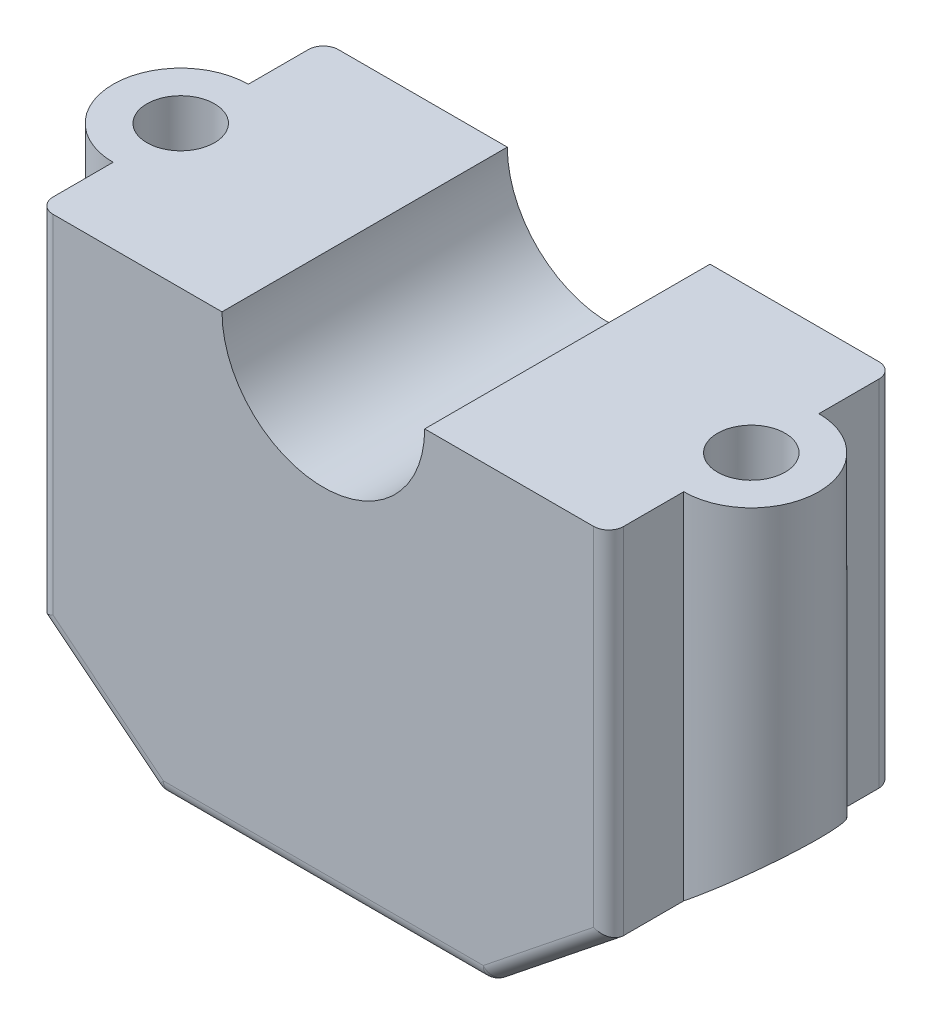
ISO-10303-21;
HEADER;
FILE_DESCRIPTION(('STEP AP214'),'2;1');
FILE_NAME('part.step','',(''),(''),'','','');
FILE_SCHEMA(('AUTOMOTIVE_DESIGN { 1 0 10303 214 1 1 1 1 }'));
ENDSEC;
DATA;
#1=APPLICATION_CONTEXT('core data for automotive mechanical design processes');
#2=APPLICATION_PROTOCOL_DEFINITION('international standard','automotive_design',2000,#1);
#3=PRODUCT_CONTEXT('',#1,'mechanical');
#4=PRODUCT('Part','Part','',(#3));
#5=PRODUCT_RELATED_PRODUCT_CATEGORY('part','',(#4));
#6=PRODUCT_DEFINITION_FORMATION('','',#4);
#7=PRODUCT_DEFINITION_CONTEXT('part definition',#1,'design');
#8=PRODUCT_DEFINITION('design','',#6,#7);
#9=PRODUCT_DEFINITION_SHAPE('','',#8);
#10=(LENGTH_UNIT() NAMED_UNIT(*) SI_UNIT(.MILLI.,.METRE.));
#11=(NAMED_UNIT(*) PLANE_ANGLE_UNIT() SI_UNIT($,.RADIAN.));
#12=(NAMED_UNIT(*) SI_UNIT($,.STERADIAN.) SOLID_ANGLE_UNIT());
#13=UNCERTAINTY_MEASURE_WITH_UNIT(LENGTH_MEASURE(1.E-05),#10,'distance_accuracy_value','');
#14=(GEOMETRIC_REPRESENTATION_CONTEXT(3) GLOBAL_UNCERTAINTY_ASSIGNED_CONTEXT((#13)) GLOBAL_UNIT_ASSIGNED_CONTEXT((#10,
#11,#12)) REPRESENTATION_CONTEXT('',''));
#15=CARTESIAN_POINT('',(0.,0.,0.));
#16=DIRECTION('',(0.,0.,1.));
#17=DIRECTION('',(1.,0.,0.));
#18=AXIS2_PLACEMENT_3D('',#15,#16,#17);
#19=CARTESIAN_POINT('',(0.,0.,0.));
#20=DIRECTION('',(0.,1.,0.));
#21=DIRECTION('',(0.,0.,1.));
#22=AXIS2_PLACEMENT_3D('',#19,#20,#21);
#23=PLANE('',#22);
#24=DIRECTION('',(0.,0.,-1.));
#25=VECTOR('',#24,1.);
#26=CARTESIAN_POINT('',(-21.2984378812836,0.,0.));
#27=LINE('',#26,#25);
#28=CARTESIAN_POINT('',(-21.2984378812836,0.,17.));
#29=VERTEX_POINT('',#28);
#30=CARTESIAN_POINT('',(-21.2984378812836,0.,-17.));
#31=VERTEX_POINT('',#30);
#32=EDGE_CURVE('E252',#29,#31,#27,.T.);
#33=ORIENTED_EDGE('',*,*,#32,.T.);
#34=DIRECTION('',(1.,0.,0.));
#35=VECTOR('',#34,1.);
#36=CARTESIAN_POINT('',(22.,0.,-17.));
#37=LINE('',#36,#35);
#38=CARTESIAN_POINT('',(21.2984378812836,0.,-17.));
#39=VERTEX_POINT('',#38);
#40=EDGE_CURVE('E259',#31,#39,#37,.T.);
#41=ORIENTED_EDGE('',*,*,#40,.T.);
#42=DIRECTION('',(0.,0.,-1.));
#43=VECTOR('',#42,1.);
#44=CARTESIAN_POINT('',(21.2984378812836,0.,19.));
#45=LINE('',#44,#43);
#46=CARTESIAN_POINT('',(21.2984378812836,0.,17.));
#47=VERTEX_POINT('',#46);
#48=EDGE_CURVE('E255',#39,#47,#45,.F.);
#49=ORIENTED_EDGE('',*,*,#48,.T.);
#50=DIRECTION('',(1.,0.,0.));
#51=VECTOR('',#50,1.);
#52=CARTESIAN_POINT('',(0.,0.,17.));
#53=LINE('',#52,#51);
#54=EDGE_CURVE('E249',#47,#29,#53,.F.);
#55=ORIENTED_EDGE('',*,*,#54,.T.);
#56=EDGE_LOOP('',(#33,#41,#49,#55));
#57=FACE_BOUND('',#56,.T.);
#58=ADVANCED_FACE('F51',(#57),#23,.F.);
#59=CARTESIAN_POINT('',(0.,60.,19.));
#60=DIRECTION('',(0.,0.,-1.));
#61=DIRECTION('',(-1.,0.,0.));
#62=AXIS2_PLACEMENT_3D('',#59,#60,#61);
#63=PLANE('',#62);
#64=DIRECTION('',(-0.78086880944303,-0.624695047554424,0.));
#65=VECTOR('',#64,1.);
#66=CARTESIAN_POINT('',(36.7506099048912,14.3617376188861,19.));
#67=LINE('',#66,#65);
#68=CARTESIAN_POINT('',(21.2984378812836,2.,19.));
#69=VERTEX_POINT('',#68);
#70=CARTESIAN_POINT('',(36.,13.7612496949731,19.));
#71=VERTEX_POINT('',#70);
#72=EDGE_CURVE('E69',#69,#71,#67,.F.);
#73=ORIENTED_EDGE('',*,*,#72,.T.);
#74=DIRECTION('',(0.,-1.,0.));
#75=VECTOR('',#74,1.);
#76=CARTESIAN_POINT('',(36.,60.,19.));
#77=LINE('',#76,#75);
#78=CARTESIAN_POINT('',(36.,60.,19.));
#79=VERTEX_POINT('',#78);
#80=EDGE_CURVE('E314',#71,#79,#77,.F.);
#81=ORIENTED_EDGE('',*,*,#80,.T.);
#82=DIRECTION('',(1.,0.,0.));
#83=VECTOR('',#82,1.);
#84=CARTESIAN_POINT('',(0.,60.,19.));
#85=LINE('',#84,#83);
#86=CARTESIAN_POINT('',(13.5,60.,19.));
#87=VERTEX_POINT('',#86);
#88=EDGE_CURVE('E407',#87,#79,#85,.T.);
#89=ORIENTED_EDGE('',*,*,#88,.F.);
#90=CARTESIAN_POINT('',(0.,60.,19.));
#91=DIRECTION('',(0.,0.,1.));
#92=DIRECTION('',(1.,0.,0.));
#93=AXIS2_PLACEMENT_3D('',#90,#91,#92);
#94=CIRCLE('',#93,13.5);
#95=CARTESIAN_POINT('',(-13.5,60.,19.));
#96=VERTEX_POINT('',#95);
#97=EDGE_CURVE('E449',#96,#87,#94,.T.);
#98=ORIENTED_EDGE('',*,*,#97,.F.);
#99=CARTESIAN_POINT('',(-36.,60.,19.));
#100=VERTEX_POINT('',#99);
#101=EDGE_CURVE('E414',#100,#96,#85,.T.);
#102=ORIENTED_EDGE('',*,*,#101,.F.);
#103=DIRECTION('',(0.,-1.,0.));
#104=VECTOR('',#103,1.);
#105=CARTESIAN_POINT('',(-36.,60.,19.));
#106=LINE('',#105,#104);
#107=CARTESIAN_POINT('',(-36.,13.7612496949731,19.));
#108=VERTEX_POINT('',#107);
#109=EDGE_CURVE('E76',#100,#108,#106,.T.);
#110=ORIENTED_EDGE('',*,*,#109,.T.);
#111=DIRECTION('',(0.78086880944303,-0.624695047554424,0.));
#112=VECTOR('',#111,1.);
#113=CARTESIAN_POINT('',(-36.6042684414765,14.2446644481544,19.));
#114=LINE('',#113,#112);
#115=CARTESIAN_POINT('',(-21.2984378812836,2.,19.));
#116=VERTEX_POINT('',#115);
#117=EDGE_CURVE('E307',#108,#116,#114,.T.);
#118=ORIENTED_EDGE('',*,*,#117,.T.);
#119=DIRECTION('',(1.,0.,0.));
#120=VECTOR('',#119,1.);
#121=CARTESIAN_POINT('',(0.,2.,19.));
#122=LINE('',#121,#120);
#123=EDGE_CURVE('E304',#116,#69,#122,.T.);
#124=ORIENTED_EDGE('',*,*,#123,.T.);
#125=EDGE_LOOP('',(#73,#81,#89,#98,#102,#110,#118,#124));
#126=FACE_BOUND('',#125,.T.);
#127=ADVANCED_FACE('F456',(#126),#63,.F.);
#128=CARTESIAN_POINT('',(38.,60.,0.));
#129=DIRECTION('',(1.,0.,0.));
#130=DIRECTION('',(0.,0.,-1.));
#131=AXIS2_PLACEMENT_3D('',#128,#129,#130);
#132=PLANE('',#131);
#133=DIRECTION('',(0.,0.,1.));
#134=VECTOR('',#133,1.);
#135=CARTESIAN_POINT('',(38.,60.,0.));
#136=LINE('',#135,#134);
#137=CARTESIAN_POINT('',(38.,60.,9.00000000000002));
#138=VERTEX_POINT('',#137);
#139=CARTESIAN_POINT('',(38.,60.,17.));
#140=VERTEX_POINT('',#139);
#141=EDGE_CURVE('E438',#138,#140,#136,.T.);
#142=ORIENTED_EDGE('',*,*,#141,.T.);
#143=DIRECTION('',(0.,-1.,0.));
#144=VECTOR('',#143,1.);
#145=CARTESIAN_POINT('',(38.,12.8,17.));
#146=LINE('',#145,#144);
#147=CARTESIAN_POINT('',(38.,12.8,17.));
#148=VERTEX_POINT('',#147);
#149=EDGE_CURVE('E61',#140,#148,#146,.T.);
#150=ORIENTED_EDGE('',*,*,#149,.T.);
#151=DIRECTION('',(0.,0.,-1.));
#152=VECTOR('',#151,1.);
#153=CARTESIAN_POINT('',(38.,12.8,0.));
#154=LINE('',#153,#152);
#155=CARTESIAN_POINT('',(38.,12.8,9.00000000000002));
#156=VERTEX_POINT('',#155);
#157=EDGE_CURVE('E212',#148,#156,#154,.T.);
#158=ORIENTED_EDGE('',*,*,#157,.T.);
#159=DIRECTION('',(0.,-1.,0.));
#160=VECTOR('',#159,1.);
#161=CARTESIAN_POINT('',(38.,60.,9.00000000000002));
#162=LINE('',#161,#160);
#163=EDGE_CURVE('E210',#138,#156,#162,.T.);
#164=ORIENTED_EDGE('',*,*,#163,.F.);
#165=EDGE_LOOP('',(#142,#150,#158,#164));
#166=FACE_BOUND('',#165,.T.);
#167=ADVANCED_FACE('F498',(#166),#132,.T.);
#168=CARTESIAN_POINT('',(38.,60.,0.));
#169=DIRECTION('',(0.,-1.,0.));
#170=DIRECTION('',(0.,0.,-1.));
#171=AXIS2_PLACEMENT_3D('',#168,#169,#170);
#172=CYLINDRICAL_SURFACE('',#171,9.);
#173=ORIENTED_EDGE('',*,*,#163,.T.);
#174=CARTESIAN_POINT('',(38.,12.8,0.));
#175=DIRECTION('',(0.624695047554424,-0.78086880944303,0.));
#176=DIRECTION('',(-0.78086880944303,-0.624695047554424,0.));
#177=AXIS2_PLACEMENT_3D('',#174,#175,#176);
#178=ELLIPSE('',#177,11.5256236273791,9.);
#179=CARTESIAN_POINT('',(38.,12.8,-8.99999999999999));
#180=VERTEX_POINT('',#179);
#181=EDGE_CURVE('E195',#180,#156,#178,.T.);
#182=ORIENTED_EDGE('',*,*,#181,.F.);
#183=DIRECTION('',(0.,-1.,0.));
#184=VECTOR('',#183,1.);
#185=CARTESIAN_POINT('',(38.,60.,-8.99999999999999));
#186=LINE('',#185,#184);
#187=CARTESIAN_POINT('',(38.,60.,-8.99999999999999));
#188=VERTEX_POINT('',#187);
#189=EDGE_CURVE('E209',#188,#180,#186,.T.);
#190=ORIENTED_EDGE('',*,*,#189,.F.);
#191=CARTESIAN_POINT('',(38.,60.,0.));
#192=DIRECTION('',(0.,1.,0.));
#193=DIRECTION('',(0.,0.,1.));
#194=AXIS2_PLACEMENT_3D('',#191,#192,#193);
#195=CIRCLE('',#194,9.);
#196=EDGE_CURVE('E435',#138,#188,#195,.T.);
#197=ORIENTED_EDGE('',*,*,#196,.F.);
#198=EDGE_LOOP('',(#173,#182,#190,#197));
#199=FACE_BOUND('',#198,.T.);
#200=ADVANCED_FACE('F207',(#199),#172,.T.);
#201=DIRECTION('',(0.,0.,-1.));
#202=VECTOR('',#201,1.);
#203=CARTESIAN_POINT('',(38.,12.8,0.));
#204=LINE('',#203,#202);
#205=CARTESIAN_POINT('',(38.,12.8,-17.));
#206=VERTEX_POINT('',#205);
#207=EDGE_CURVE('E190',#180,#206,#204,.T.);
#208=ORIENTED_EDGE('',*,*,#207,.T.);
#209=DIRECTION('',(0.,-1.,0.));
#210=VECTOR('',#209,1.);
#211=CARTESIAN_POINT('',(38.,60.,-17.));
#212=LINE('',#211,#210);
#213=CARTESIAN_POINT('',(38.,60.,-17.));
#214=VERTEX_POINT('',#213);
#215=EDGE_CURVE('E295',#206,#214,#212,.F.);
#216=ORIENTED_EDGE('',*,*,#215,.T.);
#217=EDGE_CURVE('E216',#214,#188,#136,.T.);
#218=ORIENTED_EDGE('',*,*,#217,.T.);
#219=ORIENTED_EDGE('',*,*,#189,.T.);
#220=EDGE_LOOP('',(#208,#216,#218,#219));
#221=FACE_BOUND('',#220,.T.);
#222=ADVANCED_FACE('F214',(#221),#132,.T.);
#223=CARTESIAN_POINT('',(0.,60.,-19.));
#224=DIRECTION('',(0.,0.,-1.));
#225=DIRECTION('',(-1.,0.,0.));
#226=AXIS2_PLACEMENT_3D('',#223,#224,#225);
#227=PLANE('',#226);
#228=DIRECTION('',(0.78086880944303,-0.624695047554424,0.));
#229=VECTOR('',#228,1.);
#230=CARTESIAN_POINT('',(-36.7506099048912,14.3617376188861,-19.));
#231=LINE('',#230,#229);
#232=CARTESIAN_POINT('',(-21.2984378812836,2.,-19.));
#233=VERTEX_POINT('',#232);
#234=CARTESIAN_POINT('',(-36.,13.7612496949731,-19.));
#235=VERTEX_POINT('',#234);
#236=EDGE_CURVE('E274',#233,#235,#231,.F.);
#237=ORIENTED_EDGE('',*,*,#236,.T.);
#238=DIRECTION('',(0.,-1.,0.));
#239=VECTOR('',#238,1.);
#240=CARTESIAN_POINT('',(-36.,60.,-19.));
#241=LINE('',#240,#239);
#242=CARTESIAN_POINT('',(-36.,60.,-19.));
#243=VERTEX_POINT('',#242);
#244=EDGE_CURVE('E277',#235,#243,#241,.F.);
#245=ORIENTED_EDGE('',*,*,#244,.T.);
#246=DIRECTION('',(1.,0.,0.));
#247=VECTOR('',#246,1.);
#248=CARTESIAN_POINT('',(0.,60.,-19.));
#249=LINE('',#248,#247);
#250=CARTESIAN_POINT('',(-13.5,60.,-19.));
#251=VERTEX_POINT('',#250);
#252=EDGE_CURVE('E419',#243,#251,#249,.T.);
#253=ORIENTED_EDGE('',*,*,#252,.T.);
#254=CARTESIAN_POINT('',(0.,60.,-19.));
#255=DIRECTION('',(0.,0.,1.));
#256=DIRECTION('',(1.,0.,0.));
#257=AXIS2_PLACEMENT_3D('',#254,#255,#256);
#258=CIRCLE('',#257,13.5);
#259=CARTESIAN_POINT('',(13.5,60.,-19.));
#260=VERTEX_POINT('',#259);
#261=EDGE_CURVE('E451',#251,#260,#258,.T.);
#262=ORIENTED_EDGE('',*,*,#261,.T.);
#263=CARTESIAN_POINT('',(36.,60.,-19.));
#264=VERTEX_POINT('',#263);
#265=EDGE_CURVE('E426',#260,#264,#249,.T.);
#266=ORIENTED_EDGE('',*,*,#265,.T.);
#267=DIRECTION('',(0.,-1.,0.));
#268=VECTOR('',#267,1.);
#269=CARTESIAN_POINT('',(36.,60.,-19.));
#270=LINE('',#269,#268);
#271=CARTESIAN_POINT('',(36.,13.7612496949731,-19.));
#272=VERTEX_POINT('',#271);
#273=EDGE_CURVE('E265',#264,#272,#270,.T.);
#274=ORIENTED_EDGE('',*,*,#273,.T.);
#275=DIRECTION('',(-0.78086880944303,-0.624695047554424,0.));
#276=VECTOR('',#275,1.);
#277=CARTESIAN_POINT('',(36.6042684414765,14.2446644481543,-19.));
#278=LINE('',#277,#276);
#279=CARTESIAN_POINT('',(21.2984378812836,2.,-19.));
#280=VERTEX_POINT('',#279);
#281=EDGE_CURVE('E268',#272,#280,#278,.T.);
#282=ORIENTED_EDGE('',*,*,#281,.T.);
#283=DIRECTION('',(1.,0.,0.));
#284=VECTOR('',#283,1.);
#285=CARTESIAN_POINT('',(-22.,2.,-19.));
#286=LINE('',#285,#284);
#287=EDGE_CURVE('E271',#280,#233,#286,.F.);
#288=ORIENTED_EDGE('',*,*,#287,.T.);
#289=EDGE_LOOP('',(#237,#245,#253,#262,#266,#274,#282,#288));
#290=FACE_BOUND('',#289,.T.);
#291=ADVANCED_FACE('F504',(#290),#227,.T.);
#292=CARTESIAN_POINT('',(38.,60.,0.));
#293=DIRECTION('',(0.,-1.,0.));
#294=DIRECTION('',(0.,0.,-1.));
#295=AXIS2_PLACEMENT_3D('',#292,#293,#294);
#296=CYLINDRICAL_SURFACE('',#295,4.5);
#297=CARTESIAN_POINT('',(38.,60.,0.));
#298=DIRECTION('',(0.,1.,0.));
#299=DIRECTION('',(0.,0.,1.));
#300=AXIS2_PLACEMENT_3D('',#297,#298,#299);
#301=CIRCLE('',#300,4.5);
#302=CARTESIAN_POINT('',(38.,60.,4.50000000000001));
#303=VERTEX_POINT('',#302);
#304=EDGE_CURVE('E416',#303,#303,#301,.T.);
#305=ORIENTED_EDGE('',*,*,#304,.T.);
#306=EDGE_LOOP('',(#305));
#307=FACE_BOUND('',#306,.T.);
#308=CARTESIAN_POINT('',(38.,12.8,0.));
#309=DIRECTION('',(0.624695047554424,-0.78086880944303,0.));
#310=DIRECTION('',(-0.78086880944303,-0.624695047554424,0.));
#311=AXIS2_PLACEMENT_3D('',#308,#309,#310);
#312=ELLIPSE('',#311,5.76281181368956,4.5);
#313=CARTESIAN_POINT('',(33.5,9.20000000000001,0.));
#314=VERTEX_POINT('',#313);
#315=EDGE_CURVE('E203',#314,#314,#312,.T.);
#316=ORIENTED_EDGE('',*,*,#315,.T.);
#317=EDGE_LOOP('',(#316));
#318=FACE_BOUND('',#317,.T.);
#319=ADVANCED_FACE('F473',(#307,#318),#296,.F.);
#320=CARTESIAN_POINT('',(0.,60.,0.));
#321=DIRECTION('',(0.,1.,0.));
#322=DIRECTION('',(0.,0.,1.));
#323=AXIS2_PLACEMENT_3D('',#320,#321,#322);
#324=PLANE('',#323);
#325=ORIENTED_EDGE('',*,*,#252,.F.);
#326=CARTESIAN_POINT('',(-36.,60.,-17.));
#327=DIRECTION('',(0.,1.,0.));
#328=DIRECTION('',(0.,0.,1.));
#329=AXIS2_PLACEMENT_3D('',#326,#327,#328);
#330=CIRCLE('',#329,2.);
#331=CARTESIAN_POINT('',(-38.,60.,-17.));
#332=VERTEX_POINT('',#331);
#333=EDGE_CURVE('E283',#243,#332,#330,.T.);
#334=ORIENTED_EDGE('',*,*,#333,.T.);
#335=DIRECTION('',(0.,0.,1.));
#336=VECTOR('',#335,1.);
#337=CARTESIAN_POINT('',(-38.,60.,0.));
#338=LINE('',#337,#336);
#339=CARTESIAN_POINT('',(-38.,60.,-8.99999999999998));
#340=VERTEX_POINT('',#339);
#341=EDGE_CURVE('E409',#332,#340,#338,.T.);
#342=ORIENTED_EDGE('',*,*,#341,.T.);
#343=CARTESIAN_POINT('',(-38.,60.,0.));
#344=DIRECTION('',(0.,1.,0.));
#345=DIRECTION('',(0.,0.,1.));
#346=AXIS2_PLACEMENT_3D('',#343,#344,#345);
#347=CIRCLE('',#346,9.);
#348=CARTESIAN_POINT('',(-38.,60.,9.00000000000003));
#349=VERTEX_POINT('',#348);
#350=EDGE_CURVE('E404',#340,#349,#347,.T.);
#351=ORIENTED_EDGE('',*,*,#350,.T.);
#352=CARTESIAN_POINT('',(-38.,60.,17.));
#353=VERTEX_POINT('',#352);
#354=EDGE_CURVE('E396',#349,#353,#338,.T.);
#355=ORIENTED_EDGE('',*,*,#354,.T.);
#356=CARTESIAN_POINT('',(-36.,60.,17.));
#357=DIRECTION('',(0.,1.,0.));
#358=DIRECTION('',(0.,0.,1.));
#359=AXIS2_PLACEMENT_3D('',#356,#357,#358);
#360=CIRCLE('',#359,2.);
#361=EDGE_CURVE('E280',#353,#100,#360,.T.);
#362=ORIENTED_EDGE('',*,*,#361,.T.);
#363=ORIENTED_EDGE('',*,*,#101,.T.);
#364=DIRECTION('',(0.,0.,1.));
#365=VECTOR('',#364,1.);
#366=CARTESIAN_POINT('',(-13.5,60.,-19.));
#367=LINE('',#366,#365);
#368=EDGE_CURVE('E445',#251,#96,#367,.T.);
#369=ORIENTED_EDGE('',*,*,#368,.F.);
#370=EDGE_LOOP('',(#325,#334,#342,#351,#355,#362,#363,#369));
#371=FACE_BOUND('',#370,.T.);
#372=CARTESIAN_POINT('',(-38.,60.,0.));
#373=DIRECTION('',(0.,1.,0.));
#374=DIRECTION('',(0.,0.,1.));
#375=AXIS2_PLACEMENT_3D('',#372,#373,#374);
#376=CIRCLE('',#375,4.5);
#377=CARTESIAN_POINT('',(-38.,60.,4.50000000000002));
#378=VERTEX_POINT('',#377);
#379=EDGE_CURVE('E227',#378,#378,#376,.T.);
#380=ORIENTED_EDGE('',*,*,#379,.F.);
#381=EDGE_LOOP('',(#380));
#382=FACE_BOUND('',#381,.T.);
#383=ADVANCED_FACE('F401',(#371,#382),#324,.T.);
#384=CARTESIAN_POINT('',(-38.,60.,0.));
#385=DIRECTION('',(0.,-1.,0.));
#386=DIRECTION('',(0.,0.,-1.));
#387=AXIS2_PLACEMENT_3D('',#384,#385,#386);
#388=CYLINDRICAL_SURFACE('',#387,9.);
#389=DIRECTION('',(0.,-1.,0.));
#390=VECTOR('',#389,1.);
#391=CARTESIAN_POINT('',(-38.,60.,-8.99999999999998));
#392=LINE('',#391,#390);
#393=CARTESIAN_POINT('',(-38.,12.8,-8.99999999999998));
#394=VERTEX_POINT('',#393);
#395=EDGE_CURVE('E219',#340,#394,#392,.T.);
#396=ORIENTED_EDGE('',*,*,#395,.T.);
#397=CARTESIAN_POINT('',(-38.,12.8,0.));
#398=DIRECTION('',(0.624695047554424,0.78086880944303,0.));
#399=DIRECTION('',(0.78086880944303,-0.624695047554424,0.));
#400=AXIS2_PLACEMENT_3D('',#397,#398,#399);
#401=ELLIPSE('',#400,11.5256236273791,9.);
#402=CARTESIAN_POINT('',(-38.,12.8,9.00000000000003));
#403=VERTEX_POINT('',#402);
#404=EDGE_CURVE('E464',#394,#403,#401,.T.);
#405=ORIENTED_EDGE('',*,*,#404,.T.);
#406=DIRECTION('',(0.,-1.,0.));
#407=VECTOR('',#406,1.);
#408=CARTESIAN_POINT('',(-38.,60.,9.00000000000003));
#409=LINE('',#408,#407);
#410=EDGE_CURVE('E224',#349,#403,#409,.T.);
#411=ORIENTED_EDGE('',*,*,#410,.F.);
#412=ORIENTED_EDGE('',*,*,#350,.F.);
#413=EDGE_LOOP('',(#396,#405,#411,#412));
#414=FACE_BOUND('',#413,.T.);
#415=ADVANCED_FACE('F492',(#414),#388,.T.);
#416=CARTESIAN_POINT('',(-38.,60.,0.));
#417=DIRECTION('',(1.,0.,0.));
#418=DIRECTION('',(0.,0.,-1.));
#419=AXIS2_PLACEMENT_3D('',#416,#417,#418);
#420=PLANE('',#419);
#421=DIRECTION('',(0.,0.,1.));
#422=VECTOR('',#421,1.);
#423=CARTESIAN_POINT('',(-38.,12.8,0.));
#424=LINE('',#423,#422);
#425=CARTESIAN_POINT('',(-38.,12.8,17.));
#426=VERTEX_POINT('',#425);
#427=EDGE_CURVE('E398',#403,#426,#424,.T.);
#428=ORIENTED_EDGE('',*,*,#427,.T.);
#429=DIRECTION('',(0.,-1.,0.));
#430=VECTOR('',#429,1.);
#431=CARTESIAN_POINT('',(-38.,60.,17.));
#432=LINE('',#431,#430);
#433=EDGE_CURVE('E13',#426,#353,#432,.F.);
#434=ORIENTED_EDGE('',*,*,#433,.T.);
#435=ORIENTED_EDGE('',*,*,#354,.F.);
#436=ORIENTED_EDGE('',*,*,#410,.T.);
#437=EDGE_LOOP('',(#428,#434,#435,#436));
#438=FACE_BOUND('',#437,.T.);
#439=ADVANCED_FACE('F395',(#438),#420,.F.);
#440=ORIENTED_EDGE('',*,*,#341,.F.);
#441=DIRECTION('',(0.,-1.,0.));
#442=VECTOR('',#441,1.);
#443=CARTESIAN_POINT('',(-38.,12.8,-17.));
#444=LINE('',#443,#442);
#445=CARTESIAN_POINT('',(-38.,12.8,-17.));
#446=VERTEX_POINT('',#445);
#447=EDGE_CURVE('E262',#332,#446,#444,.T.);
#448=ORIENTED_EDGE('',*,*,#447,.T.);
#449=DIRECTION('',(0.,0.,1.));
#450=VECTOR('',#449,1.);
#451=CARTESIAN_POINT('',(-38.,12.8,0.));
#452=LINE('',#451,#450);
#453=EDGE_CURVE('E579',#446,#394,#452,.T.);
#454=ORIENTED_EDGE('',*,*,#453,.T.);
#455=ORIENTED_EDGE('',*,*,#395,.F.);
#456=EDGE_LOOP('',(#440,#448,#454,#455));
#457=FACE_BOUND('',#456,.T.);
#458=ADVANCED_FACE('F487',(#457),#420,.F.);
#459=CARTESIAN_POINT('',(-38.,60.,0.));
#460=DIRECTION('',(0.,-1.,0.));
#461=DIRECTION('',(0.,0.,-1.));
#462=AXIS2_PLACEMENT_3D('',#459,#460,#461);
#463=CYLINDRICAL_SURFACE('',#462,4.5);
#464=CARTESIAN_POINT('',(-38.,12.8,0.));
#465=DIRECTION('',(0.624695047554424,0.78086880944303,0.));
#466=DIRECTION('',(0.78086880944303,-0.624695047554424,0.));
#467=AXIS2_PLACEMENT_3D('',#464,#465,#466);
#468=ELLIPSE('',#467,5.76281181368956,4.5);
#469=CARTESIAN_POINT('',(-33.5,9.20000000000001,0.));
#470=VERTEX_POINT('',#469);
#471=EDGE_CURVE('E234',#470,#470,#468,.T.);
#472=ORIENTED_EDGE('',*,*,#471,.F.);
#473=EDGE_LOOP('',(#472));
#474=FACE_BOUND('',#473,.T.);
#475=ORIENTED_EDGE('',*,*,#379,.T.);
#476=EDGE_LOOP('',(#475));
#477=FACE_BOUND('',#476,.T.);
#478=ADVANCED_FACE('F478',(#474,#477),#463,.F.);
#479=ORIENTED_EDGE('',*,*,#217,.F.);
#480=CARTESIAN_POINT('',(36.,60.,-17.));
#481=DIRECTION('',(0.,1.,0.));
#482=DIRECTION('',(0.,0.,1.));
#483=AXIS2_PLACEMENT_3D('',#480,#481,#482);
#484=CIRCLE('',#483,2.);
#485=EDGE_CURVE('E301',#214,#264,#484,.T.);
#486=ORIENTED_EDGE('',*,*,#485,.T.);
#487=ORIENTED_EDGE('',*,*,#265,.F.);
#488=DIRECTION('',(0.,0.,1.));
#489=VECTOR('',#488,1.);
#490=CARTESIAN_POINT('',(13.5,60.,-19.));
#491=LINE('',#490,#489);
#492=EDGE_CURVE('E453',#260,#87,#491,.T.);
#493=ORIENTED_EDGE('',*,*,#492,.T.);
#494=ORIENTED_EDGE('',*,*,#88,.T.);
#495=CARTESIAN_POINT('',(36.,60.,17.));
#496=DIRECTION('',(0.,1.,0.));
#497=DIRECTION('',(0.,0.,1.));
#498=AXIS2_PLACEMENT_3D('',#495,#496,#497);
#499=CIRCLE('',#498,2.);
#500=EDGE_CURVE('E298',#79,#140,#499,.T.);
#501=ORIENTED_EDGE('',*,*,#500,.T.);
#502=ORIENTED_EDGE('',*,*,#141,.F.);
#503=ORIENTED_EDGE('',*,*,#196,.T.);
#504=EDGE_LOOP('',(#479,#486,#487,#493,#494,#501,#502,#503));
#505=FACE_BOUND('',#504,.T.);
#506=ORIENTED_EDGE('',*,*,#304,.F.);
#507=EDGE_LOOP('',(#506));
#508=FACE_BOUND('',#507,.T.);
#509=ADVANCED_FACE('F476',(#505,#508),#324,.T.);
#510=CARTESIAN_POINT('',(0.,60.,-19.));
#511=DIRECTION('',(0.,0.,1.));
#512=DIRECTION('',(1.,0.,0.));
#513=AXIS2_PLACEMENT_3D('',#510,#511,#512);
#514=CYLINDRICAL_SURFACE('',#513,13.5);
#515=ORIENTED_EDGE('',*,*,#97,.T.);
#516=ORIENTED_EDGE('',*,*,#492,.F.);
#517=ORIENTED_EDGE('',*,*,#261,.F.);
#518=ORIENTED_EDGE('',*,*,#368,.T.);
#519=EDGE_LOOP('',(#515,#516,#517,#518));
#520=FACE_BOUND('',#519,.T.);
#521=ADVANCED_FACE('F448',(#520),#514,.F.);
#522=CARTESIAN_POINT('',(-47.,20.,171.016764750231));
#523=DIRECTION('',(0.624695047554424,0.78086880944303,0.));
#524=DIRECTION('',(-0.78086880944303,0.624695047554424,0.));
#525=AXIS2_PLACEMENT_3D('',#522,#523,#524);
#526=PLANE('',#525);
#527=ORIENTED_EDGE('',*,*,#471,.T.);
#528=EDGE_LOOP('',(#527));
#529=FACE_BOUND('',#528,.T.);
#530=ORIENTED_EDGE('',*,*,#453,.F.);
#531=DIRECTION('',(0.78086880944303,-0.624695047554424,0.));
#532=VECTOR('',#531,1.);
#533=CARTESIAN_POINT('',(-22.,0.,-17.));
#534=LINE('',#533,#532);
#535=CARTESIAN_POINT('',(-22.5478279763924,0.438262381113938,-17.));
#536=VERTEX_POINT('',#535);
#537=EDGE_CURVE('E292',#446,#536,#534,.T.);
#538=ORIENTED_EDGE('',*,*,#537,.T.);
#539=DIRECTION('',(0.,0.,-1.));
#540=VECTOR('',#539,1.);
#541=CARTESIAN_POINT('',(-22.5478279763924,0.438262381113941,171.016764750231));
#542=LINE('',#541,#540);
#543=CARTESIAN_POINT('',(-22.5478279763924,0.438262381113939,17.));
#544=VERTEX_POINT('',#543);
#545=EDGE_CURVE('E289',#536,#544,#542,.F.);
#546=ORIENTED_EDGE('',*,*,#545,.T.);
#547=DIRECTION('',(0.78086880944303,-0.624695047554424,0.));
#548=VECTOR('',#547,1.);
#549=CARTESIAN_POINT('',(-47.,20.,17.));
#550=LINE('',#549,#548);
#551=EDGE_CURVE('E286',#544,#426,#550,.F.);
#552=ORIENTED_EDGE('',*,*,#551,.T.);
#553=ORIENTED_EDGE('',*,*,#427,.F.);
#554=ORIENTED_EDGE('',*,*,#404,.F.);
#555=EDGE_LOOP('',(#530,#538,#546,#552,#553,#554));
#556=FACE_BOUND('',#555,.T.);
#557=ADVANCED_FACE('F485',(#529,#556),#526,.F.);
#558=CARTESIAN_POINT('',(47.,20.,171.016764750231));
#559=DIRECTION('',(0.624695047554424,-0.78086880944303,0.));
#560=DIRECTION('',(0.78086880944303,0.624695047554424,0.));
#561=AXIS2_PLACEMENT_3D('',#558,#559,#560);
#562=PLANE('',#561);
#563=ORIENTED_EDGE('',*,*,#315,.F.);
#564=EDGE_LOOP('',(#563));
#565=FACE_BOUND('',#564,.T.);
#566=DIRECTION('',(0.,0.,-1.));
#567=VECTOR('',#566,1.);
#568=CARTESIAN_POINT('',(22.5478279763924,0.438262381113936,-19.));
#569=LINE('',#568,#567);
#570=CARTESIAN_POINT('',(22.5478279763924,0.438262381113936,17.));
#571=VERTEX_POINT('',#570);
#572=CARTESIAN_POINT('',(22.5478279763924,0.438262381113937,-17.));
#573=VERTEX_POINT('',#572);
#574=EDGE_CURVE('E244',#571,#573,#569,.T.);
#575=ORIENTED_EDGE('',*,*,#574,.T.);
#576=DIRECTION('',(-0.78086880944303,-0.624695047554424,0.));
#577=VECTOR('',#576,1.);
#578=CARTESIAN_POINT('',(46.9999999999999,20.,-17.));
#579=LINE('',#578,#577);
#580=EDGE_CURVE('E198',#573,#206,#579,.F.);
#581=ORIENTED_EDGE('',*,*,#580,.T.);
#582=ORIENTED_EDGE('',*,*,#207,.F.);
#583=ORIENTED_EDGE('',*,*,#181,.T.);
#584=ORIENTED_EDGE('',*,*,#157,.F.);
#585=DIRECTION('',(-0.78086880944303,-0.624695047554424,0.));
#586=VECTOR('',#585,1.);
#587=CARTESIAN_POINT('',(22.,0.,17.));
#588=LINE('',#587,#586);
#589=EDGE_CURVE('E238',#148,#571,#588,.T.);
#590=ORIENTED_EDGE('',*,*,#589,.T.);
#591=EDGE_LOOP('',(#575,#581,#582,#583,#584,#590));
#592=FACE_BOUND('',#591,.T.);
#593=ADVANCED_FACE('F193',(#565,#592),#562,.T.);
#594=CARTESIAN_POINT('',(-36.,60.,17.));
#595=DIRECTION('',(0.,-1.,0.));
#596=DIRECTION('',(0.,0.,-1.));
#597=AXIS2_PLACEMENT_3D('',#594,#595,#596);
#598=CYLINDRICAL_SURFACE('',#597,2.);
#599=ORIENTED_EDGE('',*,*,#361,.F.);
#600=ORIENTED_EDGE('',*,*,#433,.F.);
#601=CARTESIAN_POINT('',(-36.,13.7612496949731,17.));
#602=DIRECTION('',(0.433188730489134,-0.901303236306856,0.));
#603=DIRECTION('',(-0.901303236306856,-0.433188730489134,0.));
#604=AXIS2_PLACEMENT_3D('',#601,#602,#603);
#605=ELLIPSE('',#604,2.21900900766219,2.);
#606=EDGE_CURVE('E55',#108,#426,#605,.T.);
#607=ORIENTED_EDGE('',*,*,#606,.F.);
#608=ORIENTED_EDGE('',*,*,#109,.F.);
#609=EDGE_LOOP('',(#599,#600,#607,#608));
#610=FACE_BOUND('',#609,.T.);
#611=ADVANCED_FACE('F53',(#610),#598,.T.);
#612=CARTESIAN_POINT('',(-36.,60.,-17.));
#613=DIRECTION('',(0.,1.,0.));
#614=DIRECTION('',(0.,0.,1.));
#615=AXIS2_PLACEMENT_3D('',#612,#613,#614);
#616=CYLINDRICAL_SURFACE('',#615,2.);
#617=ORIENTED_EDGE('',*,*,#333,.F.);
#618=ORIENTED_EDGE('',*,*,#244,.F.);
#619=CARTESIAN_POINT('',(-36.,13.7612496949731,-17.));
#620=DIRECTION('',(-0.433188730489134,0.901303236306856,0.));
#621=DIRECTION('',(-0.901303236306856,-0.433188730489134,0.));
#622=AXIS2_PLACEMENT_3D('',#619,#620,#621);
#623=ELLIPSE('',#622,2.21900900766219,2.);
#624=EDGE_CURVE('E372',#446,#235,#623,.F.);
#625=ORIENTED_EDGE('',*,*,#624,.F.);
#626=ORIENTED_EDGE('',*,*,#447,.F.);
#627=EDGE_LOOP('',(#617,#618,#625,#626));
#628=FACE_BOUND('',#627,.T.);
#629=ADVANCED_FACE('F569',(#628),#616,.T.);
#630=CARTESIAN_POINT('',(-36.6042684414765,14.2446644481544,17.));
#631=DIRECTION('',(0.78086880944303,-0.624695047554424,0.));
#632=DIRECTION('',(0.624695047554424,0.78086880944303,0.));
#633=AXIS2_PLACEMENT_3D('',#630,#631,#632);
#634=CYLINDRICAL_SURFACE('',#633,2.);
#635=ORIENTED_EDGE('',*,*,#606,.T.);
#636=ORIENTED_EDGE('',*,*,#551,.F.);
#637=CARTESIAN_POINT('',(-21.2984378812836,2.,17.));
#638=DIRECTION('',(0.780868809443031,-0.624695047554423,0.));
#639=DIRECTION('',(0.624695047554424,0.780868809443031,0.));
#640=AXIS2_PLACEMENT_3D('',#637,#638,#639);
#641=CIRCLE('',#640,2.);
#642=EDGE_CURVE('E365',#116,#544,#641,.T.);
#643=ORIENTED_EDGE('',*,*,#642,.F.);
#644=ORIENTED_EDGE('',*,*,#117,.F.);
#645=EDGE_LOOP('',(#635,#636,#643,#644));
#646=FACE_BOUND('',#645,.T.);
#647=ADVANCED_FACE('F386',(#646),#634,.T.);
#648=CARTESIAN_POINT('',(-45.7506099048912,21.5617376188861,-17.));
#649=DIRECTION('',(-0.78086880944303,0.624695047554424,0.));
#650=DIRECTION('',(-0.624695047554424,-0.78086880944303,0.));
#651=AXIS2_PLACEMENT_3D('',#648,#649,#650);
#652=CYLINDRICAL_SURFACE('',#651,2.);
#653=ORIENTED_EDGE('',*,*,#624,.T.);
#654=ORIENTED_EDGE('',*,*,#236,.F.);
#655=CARTESIAN_POINT('',(-21.2984378812836,2.,-17.));
#656=DIRECTION('',(0.780868809443031,-0.624695047554424,0.));
#657=DIRECTION('',(0.624695047554424,0.780868809443031,0.));
#658=AXIS2_PLACEMENT_3D('',#655,#656,#657);
#659=CIRCLE('',#658,2.);
#660=EDGE_CURVE('E361',#536,#233,#659,.T.);
#661=ORIENTED_EDGE('',*,*,#660,.F.);
#662=ORIENTED_EDGE('',*,*,#537,.F.);
#663=EDGE_LOOP('',(#653,#654,#661,#662));
#664=FACE_BOUND('',#663,.T.);
#665=ADVANCED_FACE('F564',(#664),#652,.T.);
#666=CARTESIAN_POINT('',(-21.2984378812836,2.,0.));
#667=DIRECTION('',(0.,0.,-1.));
#668=DIRECTION('',(-1.,0.,0.));
#669=AXIS2_PLACEMENT_3D('',#666,#667,#668);
#670=CYLINDRICAL_SURFACE('',#669,2.);
#671=CARTESIAN_POINT('',(-21.2984378812836,2.,17.));
#672=DIRECTION('',(0.,0.,1.));
#673=DIRECTION('',(1.,0.,0.));
#674=AXIS2_PLACEMENT_3D('',#671,#672,#673);
#675=CIRCLE('',#674,2.);
#676=EDGE_CURVE('E369',#544,#29,#675,.T.);
#677=ORIENTED_EDGE('',*,*,#676,.F.);
#678=ORIENTED_EDGE('',*,*,#545,.F.);
#679=CARTESIAN_POINT('',(-21.2984378812836,2.,-17.));
#680=DIRECTION('',(0.,0.,-1.));
#681=DIRECTION('',(-1.,0.,0.));
#682=AXIS2_PLACEMENT_3D('',#679,#680,#681);
#683=CIRCLE('',#682,2.);
#684=EDGE_CURVE('E357',#31,#536,#683,.T.);
#685=ORIENTED_EDGE('',*,*,#684,.F.);
#686=ORIENTED_EDGE('',*,*,#32,.F.);
#687=EDGE_LOOP('',(#677,#678,#685,#686));
#688=FACE_BOUND('',#687,.T.);
#689=ADVANCED_FACE('F560',(#688),#670,.T.);
#690=CARTESIAN_POINT('',(-21.2984378812836,2.,17.));
#691=DIRECTION('',(0.,0.,1.));
#692=DIRECTION('',(0.,-1.,0.));
#693=AXIS2_PLACEMENT_3D('',#690,#691,#692);
#694=SPHERICAL_SURFACE('',#693,2.);
#695=ORIENTED_EDGE('',*,*,#642,.T.);
#696=ORIENTED_EDGE('',*,*,#676,.T.);
#697=CARTESIAN_POINT('',(-21.2984378812836,2.,17.));
#698=DIRECTION('',(-1.,0.,0.));
#699=DIRECTION('',(0.,0.,1.));
#700=AXIS2_PLACEMENT_3D('',#697,#698,#699);
#701=CIRCLE('',#700,2.);
#702=EDGE_CURVE('E353',#116,#29,#701,.F.);
#703=ORIENTED_EDGE('',*,*,#702,.F.);
#704=EDGE_LOOP('',(#695,#696,#703));
#705=FACE_BOUND('',#704,.T.);
#706=ADVANCED_FACE('F556',(#705),#694,.T.);
#707=CARTESIAN_POINT('',(36.,60.,17.));
#708=DIRECTION('',(0.,1.,0.));
#709=DIRECTION('',(0.,0.,1.));
#710=AXIS2_PLACEMENT_3D('',#707,#708,#709);
#711=CYLINDRICAL_SURFACE('',#710,2.);
#712=ORIENTED_EDGE('',*,*,#500,.F.);
#713=ORIENTED_EDGE('',*,*,#80,.F.);
#714=CARTESIAN_POINT('',(36.,13.7612496949731,17.));
#715=DIRECTION('',(0.433188730489134,0.901303236306856,0.));
#716=DIRECTION('',(-0.901303236306856,0.433188730489134,0.));
#717=AXIS2_PLACEMENT_3D('',#714,#715,#716);
#718=ELLIPSE('',#717,2.21900900766219,2.);
#719=EDGE_CURVE('E349',#148,#71,#718,.F.);
#720=ORIENTED_EDGE('',*,*,#719,.F.);
#721=ORIENTED_EDGE('',*,*,#149,.F.);
#722=EDGE_LOOP('',(#712,#713,#720,#721));
#723=FACE_BOUND('',#722,.T.);
#724=ADVANCED_FACE('F552',(#723),#711,.T.);
#725=CARTESIAN_POINT('',(36.,60.,-17.));
#726=DIRECTION('',(0.,-1.,0.));
#727=DIRECTION('',(0.,0.,-1.));
#728=AXIS2_PLACEMENT_3D('',#725,#726,#727);
#729=CYLINDRICAL_SURFACE('',#728,2.);
#730=ORIENTED_EDGE('',*,*,#485,.F.);
#731=ORIENTED_EDGE('',*,*,#215,.F.);
#732=CARTESIAN_POINT('',(36.,13.7612496949731,-17.));
#733=DIRECTION('',(-0.433188730489134,-0.901303236306856,0.));
#734=DIRECTION('',(0.901303236306856,-0.433188730489134,0.));
#735=AXIS2_PLACEMENT_3D('',#732,#733,#734);
#736=ELLIPSE('',#735,2.21900900766219,2.);
#737=EDGE_CURVE('E345',#272,#206,#736,.T.);
#738=ORIENTED_EDGE('',*,*,#737,.F.);
#739=ORIENTED_EDGE('',*,*,#273,.F.);
#740=EDGE_LOOP('',(#730,#731,#738,#739));
#741=FACE_BOUND('',#740,.T.);
#742=ADVANCED_FACE('F548',(#741),#729,.T.);
#743=CARTESIAN_POINT('',(-21.2984378812836,2.,-17.));
#744=DIRECTION('',(0.,0.,-1.));
#745=DIRECTION('',(-1.,0.,0.));
#746=AXIS2_PLACEMENT_3D('',#743,#744,#745);
#747=SPHERICAL_SURFACE('',#746,2.);
#748=ORIENTED_EDGE('',*,*,#684,.T.);
#749=ORIENTED_EDGE('',*,*,#660,.T.);
#750=CARTESIAN_POINT('',(-21.2984378812836,2.,-17.));
#751=DIRECTION('',(-1.,0.,0.));
#752=DIRECTION('',(0.,0.,1.));
#753=AXIS2_PLACEMENT_3D('',#750,#751,#752);
#754=CIRCLE('',#753,2.);
#755=EDGE_CURVE('E341',#31,#233,#754,.F.);
#756=ORIENTED_EDGE('',*,*,#755,.F.);
#757=EDGE_LOOP('',(#748,#749,#756));
#758=FACE_BOUND('',#757,.T.);
#759=ADVANCED_FACE('F544',(#758),#747,.T.);
#760=CARTESIAN_POINT('',(0.,2.,17.));
#761=DIRECTION('',(1.,0.,0.));
#762=DIRECTION('',(0.,0.,-1.));
#763=AXIS2_PLACEMENT_3D('',#760,#761,#762);
#764=CYLINDRICAL_SURFACE('',#763,2.);
#765=ORIENTED_EDGE('',*,*,#702,.T.);
#766=ORIENTED_EDGE('',*,*,#54,.F.);
#767=CARTESIAN_POINT('',(21.2984378812836,2.,17.));
#768=DIRECTION('',(1.,0.,0.));
#769=DIRECTION('',(0.,1.,0.));
#770=AXIS2_PLACEMENT_3D('',#767,#768,#769);
#771=CIRCLE('',#770,2.);
#772=EDGE_CURVE('E337',#69,#47,#771,.T.);
#773=ORIENTED_EDGE('',*,*,#772,.F.);
#774=ORIENTED_EDGE('',*,*,#123,.F.);
#775=EDGE_LOOP('',(#765,#766,#773,#774));
#776=FACE_BOUND('',#775,.T.);
#777=ADVANCED_FACE('F540',(#776),#764,.T.);
#778=CARTESIAN_POINT('',(45.7506099048911,21.5617376188861,17.));
#779=DIRECTION('',(0.78086880944303,0.624695047554424,0.));
#780=DIRECTION('',(-0.624695047554424,0.78086880944303,0.));
#781=AXIS2_PLACEMENT_3D('',#778,#779,#780);
#782=CYLINDRICAL_SURFACE('',#781,2.);
#783=ORIENTED_EDGE('',*,*,#719,.T.);
#784=ORIENTED_EDGE('',*,*,#72,.F.);
#785=CARTESIAN_POINT('',(21.2984378812836,2.,17.));
#786=DIRECTION('',(-0.780868809443031,-0.624695047554424,0.));
#787=DIRECTION('',(0.624695047554424,-0.780868809443031,0.));
#788=AXIS2_PLACEMENT_3D('',#785,#786,#787);
#789=CIRCLE('',#788,2.);
#790=EDGE_CURVE('E333',#571,#69,#789,.T.);
#791=ORIENTED_EDGE('',*,*,#790,.F.);
#792=ORIENTED_EDGE('',*,*,#589,.F.);
#793=EDGE_LOOP('',(#783,#784,#791,#792));
#794=FACE_BOUND('',#793,.T.);
#795=ADVANCED_FACE('F536',(#794),#782,.T.);
#796=CARTESIAN_POINT('',(36.6042684414765,14.2446644481543,-17.));
#797=DIRECTION('',(-0.78086880944303,-0.624695047554424,0.));
#798=DIRECTION('',(0.624695047554424,-0.78086880944303,0.));
#799=AXIS2_PLACEMENT_3D('',#796,#797,#798);
#800=CYLINDRICAL_SURFACE('',#799,2.);
#801=ORIENTED_EDGE('',*,*,#737,.T.);
#802=ORIENTED_EDGE('',*,*,#580,.F.);
#803=CARTESIAN_POINT('',(21.2984378812836,2.,-17.));
#804=DIRECTION('',(-0.780868809443033,-0.624695047554421,0.));
#805=DIRECTION('',(0.624695047554421,-0.780868809443033,0.));
#806=AXIS2_PLACEMENT_3D('',#803,#804,#805);
#807=CIRCLE('',#806,2.);
#808=EDGE_CURVE('E329',#280,#573,#807,.T.);
#809=ORIENTED_EDGE('',*,*,#808,.F.);
#810=ORIENTED_EDGE('',*,*,#281,.F.);
#811=EDGE_LOOP('',(#801,#802,#809,#810));
#812=FACE_BOUND('',#811,.T.);
#813=ADVANCED_FACE('F532',(#812),#800,.T.);
#814=CARTESIAN_POINT('',(0.,2.,-17.));
#815=DIRECTION('',(-1.,0.,0.));
#816=DIRECTION('',(0.,0.,1.));
#817=AXIS2_PLACEMENT_3D('',#814,#815,#816);
#818=CYLINDRICAL_SURFACE('',#817,2.);
#819=ORIENTED_EDGE('',*,*,#755,.T.);
#820=ORIENTED_EDGE('',*,*,#287,.F.);
#821=CARTESIAN_POINT('',(21.2984378812836,2.,-17.));
#822=DIRECTION('',(1.,0.,0.));
#823=DIRECTION('',(0.,0.,-1.));
#824=AXIS2_PLACEMENT_3D('',#821,#822,#823);
#825=CIRCLE('',#824,2.);
#826=EDGE_CURVE('E325',#39,#280,#825,.T.);
#827=ORIENTED_EDGE('',*,*,#826,.F.);
#828=ORIENTED_EDGE('',*,*,#40,.F.);
#829=EDGE_LOOP('',(#819,#820,#827,#828));
#830=FACE_BOUND('',#829,.T.);
#831=ADVANCED_FACE('F528',(#830),#818,.T.);
#832=CARTESIAN_POINT('',(21.2984378812836,2.,17.));
#833=DIRECTION('',(0.,0.,1.));
#834=DIRECTION('',(0.,-1.,0.));
#835=AXIS2_PLACEMENT_3D('',#832,#833,#834);
#836=SPHERICAL_SURFACE('',#835,2.);
#837=ORIENTED_EDGE('',*,*,#790,.T.);
#838=ORIENTED_EDGE('',*,*,#772,.T.);
#839=CARTESIAN_POINT('',(21.2984378812836,2.,17.));
#840=DIRECTION('',(0.,0.,1.));
#841=DIRECTION('',(1.,0.,0.));
#842=AXIS2_PLACEMENT_3D('',#839,#840,#841);
#843=CIRCLE('',#842,2.);
#844=EDGE_CURVE('E322',#571,#47,#843,.F.);
#845=ORIENTED_EDGE('',*,*,#844,.F.);
#846=EDGE_LOOP('',(#837,#838,#845));
#847=FACE_BOUND('',#846,.T.);
#848=ADVANCED_FACE('F524',(#847),#836,.T.);
#849=CARTESIAN_POINT('',(21.2984378812836,2.,-17.));
#850=DIRECTION('',(0.,0.,-1.));
#851=DIRECTION('',(-1.,0.,0.));
#852=AXIS2_PLACEMENT_3D('',#849,#850,#851);
#853=SPHERICAL_SURFACE('',#852,2.);
#854=ORIENTED_EDGE('',*,*,#826,.T.);
#855=ORIENTED_EDGE('',*,*,#808,.T.);
#856=CARTESIAN_POINT('',(21.2984378812836,2.,-17.));
#857=DIRECTION('',(0.,0.,-1.));
#858=DIRECTION('',(-1.,0.,0.));
#859=AXIS2_PLACEMENT_3D('',#856,#857,#858);
#860=CIRCLE('',#859,2.);
#861=EDGE_CURVE('E319',#39,#573,#860,.F.);
#862=ORIENTED_EDGE('',*,*,#861,.F.);
#863=EDGE_LOOP('',(#854,#855,#862));
#864=FACE_BOUND('',#863,.T.);
#865=ADVANCED_FACE('F520',(#864),#853,.T.);
#866=CARTESIAN_POINT('',(21.2984378812836,2.,171.016764750231));
#867=DIRECTION('',(0.,0.,1.));
#868=DIRECTION('',(1.,0.,0.));
#869=AXIS2_PLACEMENT_3D('',#866,#867,#868);
#870=CYLINDRICAL_SURFACE('',#869,2.);
#871=ORIENTED_EDGE('',*,*,#844,.T.);
#872=ORIENTED_EDGE('',*,*,#48,.F.);
#873=ORIENTED_EDGE('',*,*,#861,.T.);
#874=ORIENTED_EDGE('',*,*,#574,.F.);
#875=EDGE_LOOP('',(#871,#872,#873,#874));
#876=FACE_BOUND('',#875,.T.);
#877=ADVANCED_FACE('F517',(#876),#870,.T.);
#878=CLOSED_SHELL('',(#58,#127,#167,#200,#222,#291,#319,#383,#415,#439,#458,#478,#509,#521,#557,
#593,#611,#629,#647,#665,#689,#706,#724,#742,#759,#777,#795,#813,#831,#848,#865,#877));
#879=MANIFOLD_SOLID_BREP('B2',#878);
#880=ADVANCED_BREP_SHAPE_REPRESENTATION('',(#18,#879),#14);
#881=SHAPE_DEFINITION_REPRESENTATION(#9,#880);
ENDSEC;
END-ISO-10303-21;
